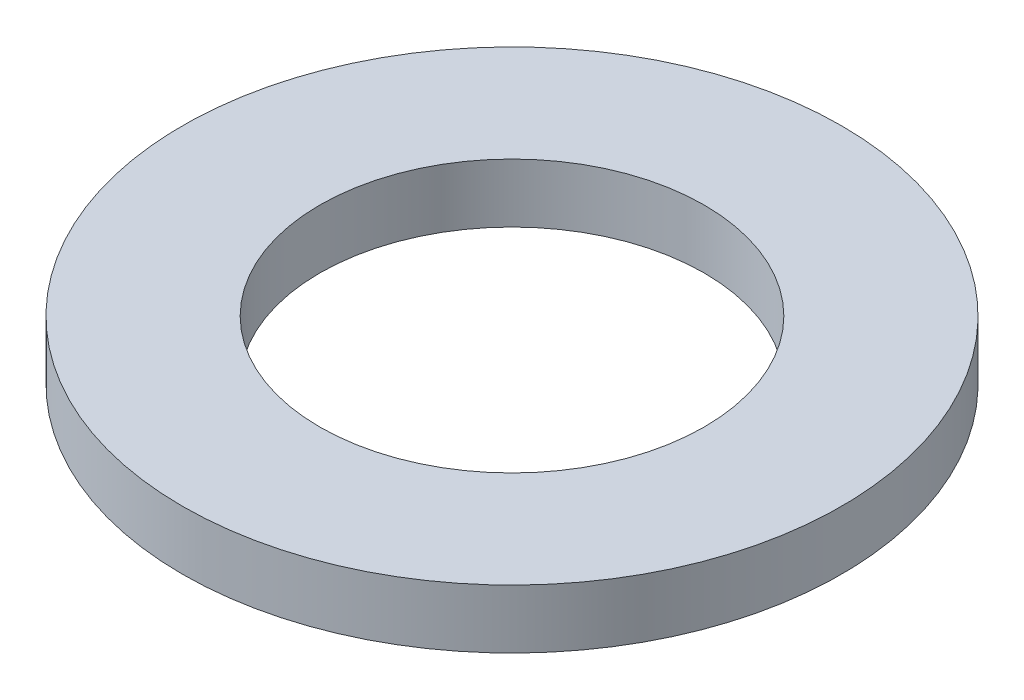
ISO-10303-21;
HEADER;
FILE_DESCRIPTION(('STEP AP214'),'2;1');
FILE_NAME('part.step','',(''),(''),'','','');
FILE_SCHEMA(('AUTOMOTIVE_DESIGN { 1 0 10303 214 1 1 1 1 }'));
ENDSEC;
DATA;
#1=APPLICATION_CONTEXT('core data for automotive mechanical design processes');
#2=APPLICATION_PROTOCOL_DEFINITION('international standard','automotive_design',2000,#1);
#3=PRODUCT_CONTEXT('',#1,'mechanical');
#4=PRODUCT('Part','Part','',(#3));
#5=PRODUCT_RELATED_PRODUCT_CATEGORY('part','',(#4));
#6=PRODUCT_DEFINITION_FORMATION('','',#4);
#7=PRODUCT_DEFINITION_CONTEXT('part definition',#1,'design');
#8=PRODUCT_DEFINITION('design','',#6,#7);
#9=PRODUCT_DEFINITION_SHAPE('','',#8);
#10=(LENGTH_UNIT() NAMED_UNIT(*) SI_UNIT(.MILLI.,.METRE.));
#11=(NAMED_UNIT(*) PLANE_ANGLE_UNIT() SI_UNIT($,.RADIAN.));
#12=(NAMED_UNIT(*) SI_UNIT($,.STERADIAN.) SOLID_ANGLE_UNIT());
#13=UNCERTAINTY_MEASURE_WITH_UNIT(LENGTH_MEASURE(1.E-05),#10,'distance_accuracy_value','');
#14=(GEOMETRIC_REPRESENTATION_CONTEXT(3) GLOBAL_UNCERTAINTY_ASSIGNED_CONTEXT((#13)) GLOBAL_UNIT_ASSIGNED_CONTEXT((#10,
#11,#12)) REPRESENTATION_CONTEXT('',''));
#15=CARTESIAN_POINT('',(0.,0.,0.));
#16=DIRECTION('',(0.,0.,1.));
#17=DIRECTION('',(1.,0.,0.));
#18=AXIS2_PLACEMENT_3D('',#15,#16,#17);
#19=CARTESIAN_POINT('',(0.,3.4036,0.));
#20=DIRECTION('',(0.,-1.,0.));
#21=DIRECTION('',(0.,0.,-1.));
#22=AXIS2_PLACEMENT_3D('',#19,#20,#21);
#23=CYLINDRICAL_SURFACE('',#22,19.05);
#24=CARTESIAN_POINT('',(0.,3.4036,0.));
#25=DIRECTION('',(0.,1.,0.));
#26=DIRECTION('',(0.,0.,1.));
#27=AXIS2_PLACEMENT_3D('',#24,#25,#26);
#28=CIRCLE('',#27,19.05);
#29=CARTESIAN_POINT('',(0.,3.4036,19.05));
#30=VERTEX_POINT('',#29);
#31=EDGE_CURVE('E10',#30,#30,#28,.T.);
#32=ORIENTED_EDGE('',*,*,#31,.F.);
#33=EDGE_LOOP('',(#32));
#34=FACE_BOUND('',#33,.T.);
#35=CARTESIAN_POINT('',(0.,0.,0.));
#36=DIRECTION('',(0.,1.,0.));
#37=DIRECTION('',(0.,0.,1.));
#38=AXIS2_PLACEMENT_3D('',#35,#36,#37);
#39=CIRCLE('',#38,19.05);
#40=CARTESIAN_POINT('',(0.,0.,19.05));
#41=VERTEX_POINT('',#40);
#42=EDGE_CURVE('E33',#41,#41,#39,.T.);
#43=ORIENTED_EDGE('',*,*,#42,.T.);
#44=EDGE_LOOP('',(#43));
#45=FACE_BOUND('',#44,.T.);
#46=ADVANCED_FACE('F30',(#34,#45),#23,.T.);
#47=CARTESIAN_POINT('',(0.,3.4036,0.));
#48=DIRECTION('',(0.,1.,0.));
#49=DIRECTION('',(0.,0.,1.));
#50=AXIS2_PLACEMENT_3D('',#47,#48,#49);
#51=PLANE('',#50);
#52=CARTESIAN_POINT('',(0.,3.4036,0.));
#53=DIRECTION('',(0.,1.,0.));
#54=DIRECTION('',(0.,0.,1.));
#55=AXIS2_PLACEMENT_3D('',#52,#53,#54);
#56=CIRCLE('',#55,11.1125);
#57=CARTESIAN_POINT('',(0.,3.4036,11.1125));
#58=VERTEX_POINT('',#57);
#59=EDGE_CURVE('E42',#58,#58,#56,.T.);
#60=ORIENTED_EDGE('',*,*,#59,.F.);
#61=EDGE_LOOP('',(#60));
#62=FACE_BOUND('',#61,.T.);
#63=ORIENTED_EDGE('',*,*,#31,.T.);
#64=EDGE_LOOP('',(#63));
#65=FACE_BOUND('',#64,.T.);
#66=ADVANCED_FACE('F57',(#62,#65),#51,.T.);
#67=CARTESIAN_POINT('',(0.,0.,0.));
#68=DIRECTION('',(0.,1.,0.));
#69=DIRECTION('',(0.,0.,1.));
#70=AXIS2_PLACEMENT_3D('',#67,#68,#69);
#71=PLANE('',#70);
#72=CARTESIAN_POINT('',(0.,0.,0.));
#73=DIRECTION('',(0.,1.,0.));
#74=DIRECTION('',(0.,0.,1.));
#75=AXIS2_PLACEMENT_3D('',#72,#73,#74);
#76=CIRCLE('',#75,11.1125);
#77=CARTESIAN_POINT('',(0.,0.,11.1125));
#78=VERTEX_POINT('',#77);
#79=EDGE_CURVE('E40',#78,#78,#76,.T.);
#80=ORIENTED_EDGE('',*,*,#79,.T.);
#81=EDGE_LOOP('',(#80));
#82=FACE_BOUND('',#81,.T.);
#83=ORIENTED_EDGE('',*,*,#42,.F.);
#84=EDGE_LOOP('',(#83));
#85=FACE_BOUND('',#84,.T.);
#86=ADVANCED_FACE('F48',(#82,#85),#71,.F.);
#87=CARTESIAN_POINT('',(0.,0.,0.));
#88=DIRECTION('',(0.,1.,0.));
#89=DIRECTION('',(0.,0.,1.));
#90=AXIS2_PLACEMENT_3D('',#87,#88,#89);
#91=CYLINDRICAL_SURFACE('',#90,11.1125);
#92=ORIENTED_EDGE('',*,*,#79,.F.);
#93=EDGE_LOOP('',(#92));
#94=FACE_BOUND('',#93,.T.);
#95=ORIENTED_EDGE('',*,*,#59,.T.);
#96=EDGE_LOOP('',(#95));
#97=FACE_BOUND('',#96,.T.);
#98=ADVANCED_FACE('F51',(#94,#97),#91,.F.);
#99=CLOSED_SHELL('',(#46,#66,#86,#98));
#100=MANIFOLD_SOLID_BREP('B2',#99);
#101=ADVANCED_BREP_SHAPE_REPRESENTATION('',(#18,#100),#14);
#102=SHAPE_DEFINITION_REPRESENTATION(#9,#101);
ENDSEC;
END-ISO-10303-21;
